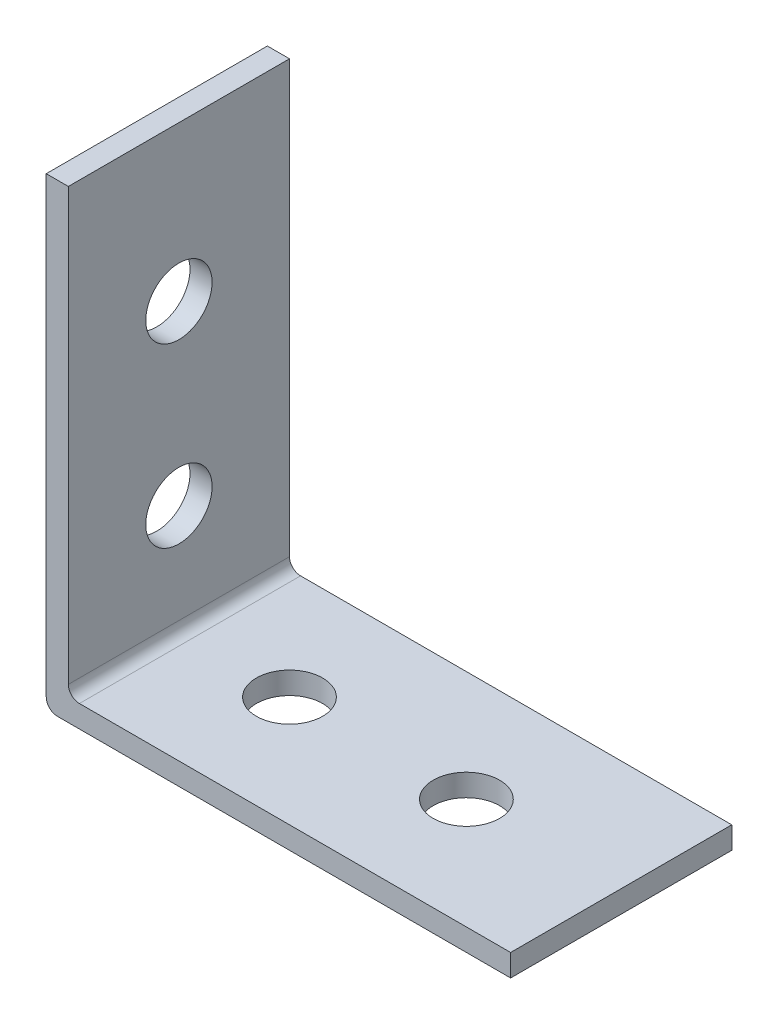
ISO-10303-21;
HEADER;
FILE_DESCRIPTION(('STEP AP214'),'2;1');
FILE_NAME('part.step','',(''),(''),'','','');
FILE_SCHEMA(('AUTOMOTIVE_DESIGN { 1 0 10303 214 1 1 1 1 }'));
ENDSEC;
DATA;
#1=APPLICATION_CONTEXT('core data for automotive mechanical design processes');
#2=APPLICATION_PROTOCOL_DEFINITION('international standard','automotive_design',2000,#1);
#3=PRODUCT_CONTEXT('',#1,'mechanical');
#4=PRODUCT('Part','Part','',(#3));
#5=PRODUCT_RELATED_PRODUCT_CATEGORY('part','',(#4));
#6=PRODUCT_DEFINITION_FORMATION('','',#4);
#7=PRODUCT_DEFINITION_CONTEXT('part definition',#1,'design');
#8=PRODUCT_DEFINITION('design','',#6,#7);
#9=PRODUCT_DEFINITION_SHAPE('','',#8);
#10=(LENGTH_UNIT() NAMED_UNIT(*) SI_UNIT(.MILLI.,.METRE.));
#11=(NAMED_UNIT(*) PLANE_ANGLE_UNIT() SI_UNIT($,.RADIAN.));
#12=(NAMED_UNIT(*) SI_UNIT($,.STERADIAN.) SOLID_ANGLE_UNIT());
#13=UNCERTAINTY_MEASURE_WITH_UNIT(LENGTH_MEASURE(1.E-05),#10,'distance_accuracy_value','');
#14=(GEOMETRIC_REPRESENTATION_CONTEXT(3) GLOBAL_UNCERTAINTY_ASSIGNED_CONTEXT((#13)) GLOBAL_UNIT_ASSIGNED_CONTEXT((#10,
#11,#12)) REPRESENTATION_CONTEXT('',''));
#15=CARTESIAN_POINT('',(0.,0.,0.));
#16=DIRECTION('',(0.,0.,1.));
#17=DIRECTION('',(1.,0.,0.));
#18=AXIS2_PLACEMENT_3D('',#15,#16,#17);
#19=CARTESIAN_POINT('',(1.86036281358595,1.26036281358594,3.));
#20=DIRECTION('',(0.,1.,0.));
#21=DIRECTION('',(0.,0.,1.));
#22=AXIS2_PLACEMENT_3D('',#19,#20,#21);
#23=PLANE('',#22);
#24=CARTESIAN_POINT('',(9.66036281358595,1.26036281358594,0.));
#25=DIRECTION('',(0.,1.,0.));
#26=DIRECTION('',(0.,0.,1.));
#27=AXIS2_PLACEMENT_3D('',#24,#25,#26);
#28=CIRCLE('',#27,0.899999999999998);
#29=CARTESIAN_POINT('',(9.66036281358595,1.26036281358594,0.899999999999998));
#30=VERTEX_POINT('',#29);
#31=EDGE_CURVE('E186',#30,#30,#28,.T.);
#32=ORIENTED_EDGE('',*,*,#31,.T.);
#33=EDGE_LOOP('',(#32));
#34=FACE_BOUND('',#33,.T.);
#35=CARTESIAN_POINT('',(4.86036281358595,1.26036281358594,0.));
#36=DIRECTION('',(0.,1.,0.));
#37=DIRECTION('',(0.,0.,1.));
#38=AXIS2_PLACEMENT_3D('',#35,#36,#37);
#39=CIRCLE('',#38,0.9);
#40=CARTESIAN_POINT('',(4.86036281358595,1.26036281358594,0.9));
#41=VERTEX_POINT('',#40);
#42=EDGE_CURVE('E180',#41,#41,#39,.T.);
#43=ORIENTED_EDGE('',*,*,#42,.T.);
#44=EDGE_LOOP('',(#43));
#45=FACE_BOUND('',#44,.T.);
#46=DIRECTION('',(1.,0.,0.));
#47=VECTOR('',#46,1.);
#48=CARTESIAN_POINT('',(1.86036281358595,1.26036281358594,3.));
#49=LINE('',#48,#47);
#50=CARTESIAN_POINT('',(1.56036281358594,1.26036281358594,3.));
#51=VERTEX_POINT('',#50);
#52=CARTESIAN_POINT('',(13.8603628135859,1.26036281358594,3.));
#53=VERTEX_POINT('',#52);
#54=EDGE_CURVE('E103',#51,#53,#49,.T.);
#55=ORIENTED_EDGE('',*,*,#54,.F.);
#56=DIRECTION('',(0.,0.,-1.));
#57=VECTOR('',#56,1.);
#58=CARTESIAN_POINT('',(1.56036281358594,1.26036281358594,3.));
#59=LINE('',#58,#57);
#60=CARTESIAN_POINT('',(1.56036281358594,1.26036281358594,-3.));
#61=VERTEX_POINT('',#60);
#62=EDGE_CURVE('E163',#51,#61,#59,.T.);
#63=ORIENTED_EDGE('',*,*,#62,.T.);
#64=DIRECTION('',(1.,0.,0.));
#65=VECTOR('',#64,1.);
#66=CARTESIAN_POINT('',(1.86036281358595,1.26036281358594,-3.));
#67=LINE('',#66,#65);
#68=CARTESIAN_POINT('',(13.8603628135859,1.26036281358594,-3.));
#69=VERTEX_POINT('',#68);
#70=EDGE_CURVE('E118',#61,#69,#67,.T.);
#71=ORIENTED_EDGE('',*,*,#70,.T.);
#72=DIRECTION('',(0.,0.,-1.));
#73=VECTOR('',#72,1.);
#74=CARTESIAN_POINT('',(13.8603628135859,1.26036281358594,3.));
#75=LINE('',#74,#73);
#76=EDGE_CURVE('E117',#53,#69,#75,.T.);
#77=ORIENTED_EDGE('',*,*,#76,.F.);
#78=EDGE_LOOP('',(#55,#63,#71,#77));
#79=FACE_BOUND('',#78,.T.);
#80=ADVANCED_FACE('F35',(#34,#45,#79),#23,.F.);
#81=CARTESIAN_POINT('',(13.8603628135859,1.86036281358594,3.));
#82=DIRECTION('',(1.,0.,0.));
#83=DIRECTION('',(0.,0.,-1.));
#84=AXIS2_PLACEMENT_3D('',#81,#82,#83);
#85=PLANE('',#84);
#86=DIRECTION('',(0.,-1.,0.));
#87=VECTOR('',#86,1.);
#88=CARTESIAN_POINT('',(13.8603628135859,1.86036281358594,-3.));
#89=LINE('',#88,#87);
#90=CARTESIAN_POINT('',(13.8603628135859,1.86036281358594,-3.));
#91=VERTEX_POINT('',#90);
#92=EDGE_CURVE('E143',#91,#69,#89,.T.);
#93=ORIENTED_EDGE('',*,*,#92,.F.);
#94=DIRECTION('',(0.,0.,-1.));
#95=VECTOR('',#94,1.);
#96=CARTESIAN_POINT('',(13.8603628135859,1.86036281358594,3.));
#97=LINE('',#96,#95);
#98=CARTESIAN_POINT('',(13.8603628135859,1.86036281358594,3.));
#99=VERTEX_POINT('',#98);
#100=EDGE_CURVE('E123',#99,#91,#97,.T.);
#101=ORIENTED_EDGE('',*,*,#100,.F.);
#102=DIRECTION('',(0.,-1.,0.));
#103=VECTOR('',#102,1.);
#104=CARTESIAN_POINT('',(13.8603628135859,1.86036281358594,3.));
#105=LINE('',#104,#103);
#106=EDGE_CURVE('E108',#99,#53,#105,.T.);
#107=ORIENTED_EDGE('',*,*,#106,.T.);
#108=ORIENTED_EDGE('',*,*,#76,.T.);
#109=EDGE_LOOP('',(#93,#101,#107,#108));
#110=FACE_BOUND('',#109,.T.);
#111=ADVANCED_FACE('F126',(#110),#85,.T.);
#112=CARTESIAN_POINT('',(1.86036281358595,1.86036281358594,3.));
#113=DIRECTION('',(0.,1.,0.));
#114=DIRECTION('',(0.,0.,1.));
#115=AXIS2_PLACEMENT_3D('',#112,#113,#114);
#116=PLANE('',#115);
#117=CARTESIAN_POINT('',(9.66036281358595,1.86036281358594,0.));
#118=DIRECTION('',(0.,1.,0.));
#119=DIRECTION('',(0.,0.,1.));
#120=AXIS2_PLACEMENT_3D('',#117,#118,#119);
#121=CIRCLE('',#120,0.899999999999998);
#122=CARTESIAN_POINT('',(9.66036281358595,1.86036281358594,0.899999999999998));
#123=VERTEX_POINT('',#122);
#124=EDGE_CURVE('E189',#123,#123,#121,.T.);
#125=ORIENTED_EDGE('',*,*,#124,.F.);
#126=EDGE_LOOP('',(#125));
#127=FACE_BOUND('',#126,.T.);
#128=CARTESIAN_POINT('',(4.86036281358595,1.86036281358594,0.));
#129=DIRECTION('',(0.,1.,0.));
#130=DIRECTION('',(0.,0.,1.));
#131=AXIS2_PLACEMENT_3D('',#128,#129,#130);
#132=CIRCLE('',#131,0.9);
#133=CARTESIAN_POINT('',(4.86036281358595,1.86036281358594,0.9));
#134=VERTEX_POINT('',#133);
#135=EDGE_CURVE('E183',#134,#134,#132,.T.);
#136=ORIENTED_EDGE('',*,*,#135,.F.);
#137=EDGE_LOOP('',(#136));
#138=FACE_BOUND('',#137,.T.);
#139=DIRECTION('',(1.,0.,0.));
#140=VECTOR('',#139,1.);
#141=CARTESIAN_POINT('',(1.86036281358595,1.86036281358594,-3.));
#142=LINE('',#141,#140);
#143=CARTESIAN_POINT('',(2.16036281358594,1.86036281358594,-3.));
#144=VERTEX_POINT('',#143);
#145=EDGE_CURVE('E146',#144,#91,#142,.T.);
#146=ORIENTED_EDGE('',*,*,#145,.F.);
#147=DIRECTION('',(0.,0.,-1.));
#148=VECTOR('',#147,1.);
#149=CARTESIAN_POINT('',(2.16036281358594,1.86036281358594,3.));
#150=LINE('',#149,#148);
#151=CARTESIAN_POINT('',(2.16036281358594,1.86036281358594,3.));
#152=VERTEX_POINT('',#151);
#153=EDGE_CURVE('E161',#144,#152,#150,.F.);
#154=ORIENTED_EDGE('',*,*,#153,.T.);
#155=DIRECTION('',(1.,0.,0.));
#156=VECTOR('',#155,1.);
#157=CARTESIAN_POINT('',(1.86036281358595,1.86036281358594,3.));
#158=LINE('',#157,#156);
#159=EDGE_CURVE('E128',#152,#99,#158,.T.);
#160=ORIENTED_EDGE('',*,*,#159,.T.);
#161=ORIENTED_EDGE('',*,*,#100,.T.);
#162=EDGE_LOOP('',(#146,#154,#160,#161));
#163=FACE_BOUND('',#162,.T.);
#164=ADVANCED_FACE('F196',(#127,#138,#163),#116,.T.);
#165=CARTESIAN_POINT('',(1.86036281358595,1.86036281358594,3.));
#166=DIRECTION('',(1.,0.,0.));
#167=DIRECTION('',(0.,0.,-1.));
#168=AXIS2_PLACEMENT_3D('',#165,#166,#167);
#169=PLANE('',#168);
#170=CARTESIAN_POINT('',(1.86036281358595,4.86036281358594,0.));
#171=DIRECTION('',(1.,0.,0.));
#172=DIRECTION('',(0.,0.,-1.));
#173=AXIS2_PLACEMENT_3D('',#170,#171,#172);
#174=CIRCLE('',#173,0.9);
#175=CARTESIAN_POINT('',(1.86036281358595,4.86036281358594,-0.9));
#176=VERTEX_POINT('',#175);
#177=EDGE_CURVE('E176',#176,#176,#174,.T.);
#178=ORIENTED_EDGE('',*,*,#177,.F.);
#179=EDGE_LOOP('',(#178));
#180=FACE_BOUND('',#179,.T.);
#181=CARTESIAN_POINT('',(1.86036281358595,9.66036281358594,0.));
#182=DIRECTION('',(1.,0.,0.));
#183=DIRECTION('',(0.,0.,-1.));
#184=AXIS2_PLACEMENT_3D('',#181,#182,#183);
#185=CIRCLE('',#184,0.9);
#186=CARTESIAN_POINT('',(1.86036281358595,9.66036281358594,-0.9));
#187=VERTEX_POINT('',#186);
#188=EDGE_CURVE('E169',#187,#187,#185,.T.);
#189=ORIENTED_EDGE('',*,*,#188,.F.);
#190=EDGE_LOOP('',(#189));
#191=FACE_BOUND('',#190,.T.);
#192=DIRECTION('',(0.,-1.,0.));
#193=VECTOR('',#192,1.);
#194=CARTESIAN_POINT('',(1.86036281358595,1.86036281358594,3.));
#195=LINE('',#194,#193);
#196=CARTESIAN_POINT('',(1.86036281358595,13.8603628135859,3.));
#197=VERTEX_POINT('',#196);
#198=CARTESIAN_POINT('',(1.86036281358595,2.16036281358594,3.));
#199=VERTEX_POINT('',#198);
#200=EDGE_CURVE('E130',#197,#199,#195,.T.);
#201=ORIENTED_EDGE('',*,*,#200,.T.);
#202=DIRECTION('',(0.,0.,-1.));
#203=VECTOR('',#202,1.);
#204=CARTESIAN_POINT('',(1.86036281358595,2.16036281358594,-3.));
#205=LINE('',#204,#203);
#206=CARTESIAN_POINT('',(1.86036281358595,2.16036281358594,-3.));
#207=VERTEX_POINT('',#206);
#208=EDGE_CURVE('E122',#199,#207,#205,.T.);
#209=ORIENTED_EDGE('',*,*,#208,.T.);
#210=DIRECTION('',(0.,-1.,0.));
#211=VECTOR('',#210,1.);
#212=CARTESIAN_POINT('',(1.86036281358595,1.86036281358594,-3.));
#213=LINE('',#212,#211);
#214=CARTESIAN_POINT('',(1.86036281358595,13.8603628135859,-3.));
#215=VERTEX_POINT('',#214);
#216=EDGE_CURVE('E148',#215,#207,#213,.T.);
#217=ORIENTED_EDGE('',*,*,#216,.F.);
#218=DIRECTION('',(0.,0.,-1.));
#219=VECTOR('',#218,1.);
#220=CARTESIAN_POINT('',(1.86036281358595,13.8603628135859,3.));
#221=LINE('',#220,#219);
#222=EDGE_CURVE('E156',#197,#215,#221,.T.);
#223=ORIENTED_EDGE('',*,*,#222,.F.);
#224=EDGE_LOOP('',(#201,#209,#217,#223));
#225=FACE_BOUND('',#224,.T.);
#226=ADVANCED_FACE('F199',(#180,#191,#225),#169,.T.);
#227=CARTESIAN_POINT('',(1.26036281358595,13.8603628135859,3.));
#228=DIRECTION('',(0.,1.,0.));
#229=DIRECTION('',(0.,0.,1.));
#230=AXIS2_PLACEMENT_3D('',#227,#228,#229);
#231=PLANE('',#230);
#232=DIRECTION('',(1.,0.,0.));
#233=VECTOR('',#232,1.);
#234=CARTESIAN_POINT('',(1.26036281358595,13.8603628135859,-3.));
#235=LINE('',#234,#233);
#236=CARTESIAN_POINT('',(1.26036281358595,13.8603628135859,-3.));
#237=VERTEX_POINT('',#236);
#238=EDGE_CURVE('E151',#237,#215,#235,.T.);
#239=ORIENTED_EDGE('',*,*,#238,.F.);
#240=DIRECTION('',(0.,0.,-1.));
#241=VECTOR('',#240,1.);
#242=CARTESIAN_POINT('',(1.26036281358595,13.8603628135859,3.));
#243=LINE('',#242,#241);
#244=CARTESIAN_POINT('',(1.26036281358595,13.8603628135859,3.));
#245=VERTEX_POINT('',#244);
#246=EDGE_CURVE('E141',#245,#237,#243,.T.);
#247=ORIENTED_EDGE('',*,*,#246,.F.);
#248=DIRECTION('',(1.,0.,0.));
#249=VECTOR('',#248,1.);
#250=CARTESIAN_POINT('',(1.26036281358595,13.8603628135859,3.));
#251=LINE('',#250,#249);
#252=EDGE_CURVE('E136',#245,#197,#251,.T.);
#253=ORIENTED_EDGE('',*,*,#252,.T.);
#254=ORIENTED_EDGE('',*,*,#222,.T.);
#255=EDGE_LOOP('',(#239,#247,#253,#254));
#256=FACE_BOUND('',#255,.T.);
#257=ADVANCED_FACE('F215',(#256),#231,.T.);
#258=CARTESIAN_POINT('',(1.26036281358595,1.86036281358594,3.));
#259=DIRECTION('',(1.,0.,0.));
#260=DIRECTION('',(0.,0.,-1.));
#261=AXIS2_PLACEMENT_3D('',#258,#259,#260);
#262=PLANE('',#261);
#263=CARTESIAN_POINT('',(1.26036281358595,4.86036281358594,0.));
#264=DIRECTION('',(1.,0.,0.));
#265=DIRECTION('',(0.,0.,-1.));
#266=AXIS2_PLACEMENT_3D('',#263,#264,#265);
#267=CIRCLE('',#266,0.9);
#268=CARTESIAN_POINT('',(1.26036281358595,4.86036281358594,-0.9));
#269=VERTEX_POINT('',#268);
#270=EDGE_CURVE('E39',#269,#269,#267,.T.);
#271=ORIENTED_EDGE('',*,*,#270,.T.);
#272=EDGE_LOOP('',(#271));
#273=FACE_BOUND('',#272,.T.);
#274=CARTESIAN_POINT('',(1.26036281358595,9.66036281358594,0.));
#275=DIRECTION('',(1.,0.,0.));
#276=DIRECTION('',(0.,0.,-1.));
#277=AXIS2_PLACEMENT_3D('',#274,#275,#276);
#278=CIRCLE('',#277,0.9);
#279=CARTESIAN_POINT('',(1.26036281358595,9.66036281358594,-0.9));
#280=VERTEX_POINT('',#279);
#281=EDGE_CURVE('E144',#280,#280,#278,.T.);
#282=ORIENTED_EDGE('',*,*,#281,.T.);
#283=EDGE_LOOP('',(#282));
#284=FACE_BOUND('',#283,.T.);
#285=DIRECTION('',(0.,1.,0.));
#286=VECTOR('',#285,1.);
#287=CARTESIAN_POINT('',(1.26036281358595,1.86036281358594,-3.));
#288=LINE('',#287,#286);
#289=CARTESIAN_POINT('',(1.26036281358595,1.56036281358594,-3.));
#290=VERTEX_POINT('',#289);
#291=EDGE_CURVE('E114',#237,#290,#288,.F.);
#292=ORIENTED_EDGE('',*,*,#291,.T.);
#293=DIRECTION('',(0.,0.,-1.));
#294=VECTOR('',#293,1.);
#295=CARTESIAN_POINT('',(1.26036281358595,1.56036281358594,3.));
#296=LINE('',#295,#294);
#297=CARTESIAN_POINT('',(1.26036281358595,1.56036281358594,3.));
#298=VERTEX_POINT('',#297);
#299=EDGE_CURVE('E52',#290,#298,#296,.F.);
#300=ORIENTED_EDGE('',*,*,#299,.T.);
#301=DIRECTION('',(0.,1.,0.));
#302=VECTOR('',#301,1.);
#303=CARTESIAN_POINT('',(1.26036281358595,1.86036281358594,3.));
#304=LINE('',#303,#302);
#305=EDGE_CURVE('E139',#245,#298,#304,.F.);
#306=ORIENTED_EDGE('',*,*,#305,.F.);
#307=ORIENTED_EDGE('',*,*,#246,.T.);
#308=EDGE_LOOP('',(#292,#300,#306,#307));
#309=FACE_BOUND('',#308,.T.);
#310=ADVANCED_FACE('F224',(#273,#284,#309),#262,.F.);
#311=CARTESIAN_POINT('',(1.86036281358595,1.86036281358594,3.));
#312=DIRECTION('',(0.,0.,-1.));
#313=DIRECTION('',(-1.,0.,0.));
#314=AXIS2_PLACEMENT_3D('',#311,#312,#313);
#315=PLANE('',#314);
#316=ORIENTED_EDGE('',*,*,#305,.T.);
#317=CARTESIAN_POINT('',(1.56036281358594,1.56036281358594,3.));
#318=DIRECTION('',(0.,0.,-1.));
#319=DIRECTION('',(-1.,0.,0.));
#320=AXIS2_PLACEMENT_3D('',#317,#318,#319);
#321=CIRCLE('',#320,0.3);
#322=EDGE_CURVE('E110',#298,#51,#321,.F.);
#323=ORIENTED_EDGE('',*,*,#322,.T.);
#324=ORIENTED_EDGE('',*,*,#54,.T.);
#325=ORIENTED_EDGE('',*,*,#106,.F.);
#326=ORIENTED_EDGE('',*,*,#159,.F.);
#327=CARTESIAN_POINT('',(2.16036281358594,2.16036281358594,3.));
#328=DIRECTION('',(0.,0.,-1.));
#329=DIRECTION('',(-1.,0.,0.));
#330=AXIS2_PLACEMENT_3D('',#327,#328,#329);
#331=CIRCLE('',#330,0.3);
#332=EDGE_CURVE('E11',#152,#199,#331,.T.);
#333=ORIENTED_EDGE('',*,*,#332,.T.);
#334=ORIENTED_EDGE('',*,*,#200,.F.);
#335=ORIENTED_EDGE('',*,*,#252,.F.);
#336=EDGE_LOOP('',(#316,#323,#324,#325,#326,#333,#334,#335));
#337=FACE_BOUND('',#336,.T.);
#338=ADVANCED_FACE('F105',(#337),#315,.F.);
#339=CARTESIAN_POINT('',(1.86036281358595,1.86036281358594,-3.));
#340=DIRECTION('',(0.,0.,-1.));
#341=DIRECTION('',(-1.,0.,0.));
#342=AXIS2_PLACEMENT_3D('',#339,#340,#341);
#343=PLANE('',#342);
#344=ORIENTED_EDGE('',*,*,#70,.F.);
#345=CARTESIAN_POINT('',(1.56036281358594,1.56036281358594,-3.));
#346=DIRECTION('',(0.,0.,-1.));
#347=DIRECTION('',(-1.,0.,0.));
#348=AXIS2_PLACEMENT_3D('',#345,#346,#347);
#349=CIRCLE('',#348,0.3);
#350=EDGE_CURVE('E60',#61,#290,#349,.T.);
#351=ORIENTED_EDGE('',*,*,#350,.T.);
#352=ORIENTED_EDGE('',*,*,#291,.F.);
#353=ORIENTED_EDGE('',*,*,#238,.T.);
#354=ORIENTED_EDGE('',*,*,#216,.T.);
#355=CARTESIAN_POINT('',(2.16036281358594,2.16036281358594,-3.));
#356=DIRECTION('',(0.,0.,-1.));
#357=DIRECTION('',(-1.,0.,0.));
#358=AXIS2_PLACEMENT_3D('',#355,#356,#357);
#359=CIRCLE('',#358,0.3);
#360=EDGE_CURVE('E44',#207,#144,#359,.F.);
#361=ORIENTED_EDGE('',*,*,#360,.T.);
#362=ORIENTED_EDGE('',*,*,#145,.T.);
#363=ORIENTED_EDGE('',*,*,#92,.T.);
#364=EDGE_LOOP('',(#344,#351,#352,#353,#354,#361,#362,#363));
#365=FACE_BOUND('',#364,.T.);
#366=ADVANCED_FACE('F217',(#365),#343,.T.);
#367=CARTESIAN_POINT('',(2.16036281358594,2.16036281358594,3.));
#368=DIRECTION('',(0.,0.,1.));
#369=DIRECTION('',(1.,0.,0.));
#370=AXIS2_PLACEMENT_3D('',#367,#368,#369);
#371=CYLINDRICAL_SURFACE('',#370,0.3);
#372=ORIENTED_EDGE('',*,*,#332,.F.);
#373=ORIENTED_EDGE('',*,*,#153,.F.);
#374=ORIENTED_EDGE('',*,*,#360,.F.);
#375=ORIENTED_EDGE('',*,*,#208,.F.);
#376=EDGE_LOOP('',(#372,#373,#374,#375));
#377=FACE_BOUND('',#376,.T.);
#378=ADVANCED_FACE('F207',(#377),#371,.F.);
#379=CARTESIAN_POINT('',(1.56036281358594,1.56036281358594,3.));
#380=DIRECTION('',(0.,0.,-1.));
#381=DIRECTION('',(-1.,0.,0.));
#382=AXIS2_PLACEMENT_3D('',#379,#380,#381);
#383=CYLINDRICAL_SURFACE('',#382,0.3);
#384=ORIENTED_EDGE('',*,*,#322,.F.);
#385=ORIENTED_EDGE('',*,*,#299,.F.);
#386=ORIENTED_EDGE('',*,*,#350,.F.);
#387=ORIENTED_EDGE('',*,*,#62,.F.);
#388=EDGE_LOOP('',(#384,#385,#386,#387));
#389=FACE_BOUND('',#388,.T.);
#390=ADVANCED_FACE('F37',(#389),#383,.T.);
#391=CARTESIAN_POINT('',(-4.13963718641406,9.66036281358594,0.));
#392=DIRECTION('',(1.,0.,0.));
#393=DIRECTION('',(0.,0.,-1.));
#394=AXIS2_PLACEMENT_3D('',#391,#392,#393);
#395=CYLINDRICAL_SURFACE('',#394,0.9);
#396=ORIENTED_EDGE('',*,*,#188,.T.);
#397=EDGE_LOOP('',(#396));
#398=FACE_BOUND('',#397,.T.);
#399=ORIENTED_EDGE('',*,*,#281,.F.);
#400=EDGE_LOOP('',(#399));
#401=FACE_BOUND('',#400,.T.);
#402=ADVANCED_FACE('F249',(#398,#401),#395,.F.);
#403=CARTESIAN_POINT('',(-4.13963718641406,4.86036281358594,0.));
#404=DIRECTION('',(1.,0.,0.));
#405=DIRECTION('',(0.,0.,-1.));
#406=AXIS2_PLACEMENT_3D('',#403,#404,#405);
#407=CYLINDRICAL_SURFACE('',#406,0.9);
#408=ORIENTED_EDGE('',*,*,#177,.T.);
#409=EDGE_LOOP('',(#408));
#410=FACE_BOUND('',#409,.T.);
#411=ORIENTED_EDGE('',*,*,#270,.F.);
#412=EDGE_LOOP('',(#411));
#413=FACE_BOUND('',#412,.T.);
#414=ADVANCED_FACE('F246',(#410,#413),#407,.F.);
#415=CARTESIAN_POINT('',(4.86036281358595,-4.13963718641406,0.));
#416=DIRECTION('',(0.,1.,0.));
#417=DIRECTION('',(0.,0.,1.));
#418=AXIS2_PLACEMENT_3D('',#415,#416,#417);
#419=CYLINDRICAL_SURFACE('',#418,0.9);
#420=ORIENTED_EDGE('',*,*,#135,.T.);
#421=EDGE_LOOP('',(#420));
#422=FACE_BOUND('',#421,.T.);
#423=ORIENTED_EDGE('',*,*,#42,.F.);
#424=EDGE_LOOP('',(#423));
#425=FACE_BOUND('',#424,.T.);
#426=ADVANCED_FACE('F248',(#422,#425),#419,.F.);
#427=CARTESIAN_POINT('',(9.66036281358595,-4.13963718641406,0.));
#428=DIRECTION('',(0.,1.,0.));
#429=DIRECTION('',(0.,0.,1.));
#430=AXIS2_PLACEMENT_3D('',#427,#428,#429);
#431=CYLINDRICAL_SURFACE('',#430,0.899999999999998);
#432=ORIENTED_EDGE('',*,*,#124,.T.);
#433=EDGE_LOOP('',(#432));
#434=FACE_BOUND('',#433,.T.);
#435=ORIENTED_EDGE('',*,*,#31,.F.);
#436=EDGE_LOOP('',(#435));
#437=FACE_BOUND('',#436,.T.);
#438=ADVANCED_FACE('F193',(#434,#437),#431,.F.);
#439=CLOSED_SHELL('',(#80,#111,#164,#226,#257,#310,#338,#366,#378,#390,#402,#414,#426,#438));
#440=MANIFOLD_SOLID_BREP('B2',#439);
#441=ADVANCED_BREP_SHAPE_REPRESENTATION('',(#18,#440),#14);
#442=SHAPE_DEFINITION_REPRESENTATION(#9,#441);
ENDSEC;
END-ISO-10303-21;
